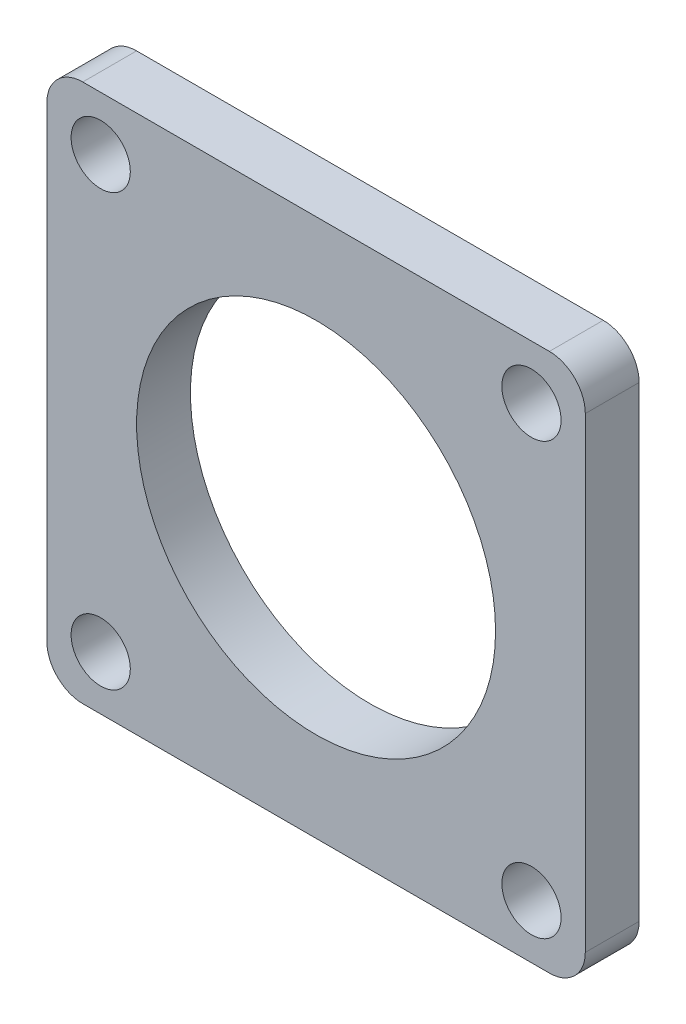
ISO-10303-21;
HEADER;
FILE_DESCRIPTION(('STEP AP214'),'2;1');
FILE_NAME('part.step','',(''),(''),'','','');
FILE_SCHEMA(('AUTOMOTIVE_DESIGN { 1 0 10303 214 1 1 1 1 }'));
ENDSEC;
DATA;
#1=APPLICATION_CONTEXT('core data for automotive mechanical design processes');
#2=APPLICATION_PROTOCOL_DEFINITION('international standard','automotive_design',2000,#1);
#3=PRODUCT_CONTEXT('',#1,'mechanical');
#4=PRODUCT('Part','Part','',(#3));
#5=PRODUCT_RELATED_PRODUCT_CATEGORY('part','',(#4));
#6=PRODUCT_DEFINITION_FORMATION('','',#4);
#7=PRODUCT_DEFINITION_CONTEXT('part definition',#1,'design');
#8=PRODUCT_DEFINITION('design','',#6,#7);
#9=PRODUCT_DEFINITION_SHAPE('','',#8);
#10=(LENGTH_UNIT() NAMED_UNIT(*) SI_UNIT(.MILLI.,.METRE.));
#11=(NAMED_UNIT(*) PLANE_ANGLE_UNIT() SI_UNIT($,.RADIAN.));
#12=(NAMED_UNIT(*) SI_UNIT($,.STERADIAN.) SOLID_ANGLE_UNIT());
#13=UNCERTAINTY_MEASURE_WITH_UNIT(LENGTH_MEASURE(1.E-05),#10,'distance_accuracy_value','');
#14=(GEOMETRIC_REPRESENTATION_CONTEXT(3) GLOBAL_UNCERTAINTY_ASSIGNED_CONTEXT((#13)) GLOBAL_UNIT_ASSIGNED_CONTEXT((#10,
#11,#12)) REPRESENTATION_CONTEXT('',''));
#15=CARTESIAN_POINT('',(0.,0.,0.));
#16=DIRECTION('',(0.,0.,1.));
#17=DIRECTION('',(1.,0.,0.));
#18=AXIS2_PLACEMENT_3D('',#15,#16,#17);
#19=CARTESIAN_POINT('',(0.,-15.,3.));
#20=DIRECTION('',(0.,-1.,0.));
#21=DIRECTION('',(1.,0.,0.));
#22=AXIS2_PLACEMENT_3D('',#19,#20,#21);
#23=PLANE('',#22);
#24=DIRECTION('',(-1.,0.,0.));
#25=VECTOR('',#24,1.);
#26=CARTESIAN_POINT('',(0.,-15.,3.));
#27=LINE('',#26,#25);
#28=CARTESIAN_POINT('',(13.,-15.,3.));
#29=VERTEX_POINT('',#28);
#30=CARTESIAN_POINT('',(-13.,-15.,3.));
#31=VERTEX_POINT('',#30);
#32=EDGE_CURVE('E162',#29,#31,#27,.T.);
#33=ORIENTED_EDGE('',*,*,#32,.T.);
#34=DIRECTION('',(0.,0.,-1.));
#35=VECTOR('',#34,1.);
#36=CARTESIAN_POINT('',(-13.,-15.,3.));
#37=LINE('',#36,#35);
#38=CARTESIAN_POINT('',(-13.,-15.,0.));
#39=VERTEX_POINT('',#38);
#40=EDGE_CURVE('E123',#31,#39,#37,.T.);
#41=ORIENTED_EDGE('',*,*,#40,.T.);
#42=DIRECTION('',(-1.,0.,0.));
#43=VECTOR('',#42,1.);
#44=CARTESIAN_POINT('',(0.,-15.,0.));
#45=LINE('',#44,#43);
#46=CARTESIAN_POINT('',(13.,-15.,0.));
#47=VERTEX_POINT('',#46);
#48=EDGE_CURVE('E107',#47,#39,#45,.T.);
#49=ORIENTED_EDGE('',*,*,#48,.F.);
#50=DIRECTION('',(0.,0.,-1.));
#51=VECTOR('',#50,1.);
#52=CARTESIAN_POINT('',(13.,-15.,3.));
#53=LINE('',#52,#51);
#54=EDGE_CURVE('E120',#47,#29,#53,.F.);
#55=ORIENTED_EDGE('',*,*,#54,.T.);
#56=EDGE_LOOP('',(#33,#41,#49,#55));
#57=FACE_BOUND('',#56,.T.);
#58=ADVANCED_FACE('F37',(#57),#23,.T.);
#59=CARTESIAN_POINT('',(15.,0.,3.));
#60=DIRECTION('',(-1.,0.,0.));
#61=DIRECTION('',(0.,-1.,0.));
#62=AXIS2_PLACEMENT_3D('',#59,#60,#61);
#63=PLANE('',#62);
#64=DIRECTION('',(0.,1.,0.));
#65=VECTOR('',#64,1.);
#66=CARTESIAN_POINT('',(15.,0.,3.));
#67=LINE('',#66,#65);
#68=CARTESIAN_POINT('',(15.,-13.,3.));
#69=VERTEX_POINT('',#68);
#70=CARTESIAN_POINT('',(15.,13.,3.));
#71=VERTEX_POINT('',#70);
#72=EDGE_CURVE('E160',#69,#71,#67,.T.);
#73=ORIENTED_EDGE('',*,*,#72,.F.);
#74=DIRECTION('',(0.,0.,-1.));
#75=VECTOR('',#74,1.);
#76=CARTESIAN_POINT('',(15.,-13.,0.));
#77=LINE('',#76,#75);
#78=CARTESIAN_POINT('',(15.,-13.,0.));
#79=VERTEX_POINT('',#78);
#80=EDGE_CURVE('E155',#69,#79,#77,.T.);
#81=ORIENTED_EDGE('',*,*,#80,.T.);
#82=DIRECTION('',(0.,1.,0.));
#83=VECTOR('',#82,1.);
#84=CARTESIAN_POINT('',(15.,0.,0.));
#85=LINE('',#84,#83);
#86=CARTESIAN_POINT('',(15.,13.,0.));
#87=VERTEX_POINT('',#86);
#88=EDGE_CURVE('E109',#79,#87,#85,.T.);
#89=ORIENTED_EDGE('',*,*,#88,.T.);
#90=DIRECTION('',(0.,0.,-1.));
#91=VECTOR('',#90,1.);
#92=CARTESIAN_POINT('',(15.,13.,3.));
#93=LINE('',#92,#91);
#94=EDGE_CURVE('E153',#87,#71,#93,.F.);
#95=ORIENTED_EDGE('',*,*,#94,.T.);
#96=EDGE_LOOP('',(#73,#81,#89,#95));
#97=FACE_BOUND('',#96,.T.);
#98=ADVANCED_FACE('F158',(#97),#63,.F.);
#99=CARTESIAN_POINT('',(0.,15.,3.));
#100=DIRECTION('',(0.,1.,0.));
#101=DIRECTION('',(0.,0.,1.));
#102=AXIS2_PLACEMENT_3D('',#99,#100,#101);
#103=PLANE('',#102);
#104=DIRECTION('',(1.,0.,0.));
#105=VECTOR('',#104,1.);
#106=CARTESIAN_POINT('',(0.,15.,3.));
#107=LINE('',#106,#105);
#108=CARTESIAN_POINT('',(-13.,15.,3.));
#109=VERTEX_POINT('',#108);
#110=CARTESIAN_POINT('',(13.,15.,3.));
#111=VERTEX_POINT('',#110);
#112=EDGE_CURVE('E161',#109,#111,#107,.T.);
#113=ORIENTED_EDGE('',*,*,#112,.T.);
#114=DIRECTION('',(0.,0.,-1.));
#115=VECTOR('',#114,1.);
#116=CARTESIAN_POINT('',(13.,15.,0.));
#117=LINE('',#116,#115);
#118=CARTESIAN_POINT('',(13.,15.,0.));
#119=VERTEX_POINT('',#118);
#120=EDGE_CURVE('E11',#111,#119,#117,.T.);
#121=ORIENTED_EDGE('',*,*,#120,.T.);
#122=DIRECTION('',(1.,0.,0.));
#123=VECTOR('',#122,1.);
#124=CARTESIAN_POINT('',(0.,15.,0.));
#125=LINE('',#124,#123);
#126=CARTESIAN_POINT('',(-13.,15.,0.));
#127=VERTEX_POINT('',#126);
#128=EDGE_CURVE('E182',#127,#119,#125,.T.);
#129=ORIENTED_EDGE('',*,*,#128,.F.);
#130=DIRECTION('',(0.,0.,-1.));
#131=VECTOR('',#130,1.);
#132=CARTESIAN_POINT('',(-13.,15.,3.));
#133=LINE('',#132,#131);
#134=EDGE_CURVE('E45',#127,#109,#133,.F.);
#135=ORIENTED_EDGE('',*,*,#134,.T.);
#136=EDGE_LOOP('',(#113,#121,#129,#135));
#137=FACE_BOUND('',#136,.T.);
#138=ADVANCED_FACE('F225',(#137),#103,.T.);
#139=CARTESIAN_POINT('',(12.,12.,3.));
#140=DIRECTION('',(0.,0.,-1.));
#141=DIRECTION('',(-1.,0.,0.));
#142=AXIS2_PLACEMENT_3D('',#139,#140,#141);
#143=CYLINDRICAL_SURFACE('',#142,1.65);
#144=CARTESIAN_POINT('',(12.,12.,3.));
#145=DIRECTION('',(0.,0.,1.));
#146=DIRECTION('',(1.,0.,0.));
#147=AXIS2_PLACEMENT_3D('',#144,#145,#146);
#148=CIRCLE('',#147,1.65);
#149=CARTESIAN_POINT('',(13.65,12.,3.));
#150=VERTEX_POINT('',#149);
#151=EDGE_CURVE('E133',#150,#150,#148,.T.);
#152=ORIENTED_EDGE('',*,*,#151,.T.);
#153=EDGE_LOOP('',(#152));
#154=FACE_BOUND('',#153,.T.);
#155=CARTESIAN_POINT('',(12.,12.,0.));
#156=DIRECTION('',(0.,0.,1.));
#157=DIRECTION('',(1.,0.,0.));
#158=AXIS2_PLACEMENT_3D('',#155,#156,#157);
#159=CIRCLE('',#158,1.65);
#160=CARTESIAN_POINT('',(13.65,12.,0.));
#161=VERTEX_POINT('',#160);
#162=EDGE_CURVE('E196',#161,#161,#159,.T.);
#163=ORIENTED_EDGE('',*,*,#162,.F.);
#164=EDGE_LOOP('',(#163));
#165=FACE_BOUND('',#164,.T.);
#166=ADVANCED_FACE('F259',(#154,#165),#143,.F.);
#167=CARTESIAN_POINT('',(-12.,-12.,3.));
#168=DIRECTION('',(0.,0.,-1.));
#169=DIRECTION('',(-1.,0.,0.));
#170=AXIS2_PLACEMENT_3D('',#167,#168,#169);
#171=CYLINDRICAL_SURFACE('',#170,1.65);
#172=CARTESIAN_POINT('',(-12.,-12.,3.));
#173=DIRECTION('',(0.,0.,1.));
#174=DIRECTION('',(1.,0.,0.));
#175=AXIS2_PLACEMENT_3D('',#172,#173,#174);
#176=CIRCLE('',#175,1.65);
#177=CARTESIAN_POINT('',(-10.35,-12.,3.));
#178=VERTEX_POINT('',#177);
#179=EDGE_CURVE('E176',#178,#178,#176,.T.);
#180=ORIENTED_EDGE('',*,*,#179,.T.);
#181=EDGE_LOOP('',(#180));
#182=FACE_BOUND('',#181,.T.);
#183=CARTESIAN_POINT('',(-12.,-12.,0.));
#184=DIRECTION('',(0.,0.,1.));
#185=DIRECTION('',(1.,0.,0.));
#186=AXIS2_PLACEMENT_3D('',#183,#184,#185);
#187=CIRCLE('',#186,1.65);
#188=CARTESIAN_POINT('',(-10.35,-12.,0.));
#189=VERTEX_POINT('',#188);
#190=EDGE_CURVE('E194',#189,#189,#187,.T.);
#191=ORIENTED_EDGE('',*,*,#190,.F.);
#192=EDGE_LOOP('',(#191));
#193=FACE_BOUND('',#192,.T.);
#194=ADVANCED_FACE('F262',(#182,#193),#171,.F.);
#195=CARTESIAN_POINT('',(0.,0.,3.));
#196=DIRECTION('',(0.,0.,-1.));
#197=DIRECTION('',(-1.,0.,0.));
#198=AXIS2_PLACEMENT_3D('',#195,#196,#197);
#199=CYLINDRICAL_SURFACE('',#198,10.);
#200=CARTESIAN_POINT('',(0.,0.,3.));
#201=DIRECTION('',(0.,0.,1.));
#202=DIRECTION('',(1.,0.,0.));
#203=AXIS2_PLACEMENT_3D('',#200,#201,#202);
#204=CIRCLE('',#203,10.);
#205=CARTESIAN_POINT('',(10.,0.,3.));
#206=VERTEX_POINT('',#205);
#207=EDGE_CURVE('E173',#206,#206,#204,.T.);
#208=ORIENTED_EDGE('',*,*,#207,.T.);
#209=EDGE_LOOP('',(#208));
#210=FACE_BOUND('',#209,.T.);
#211=CARTESIAN_POINT('',(0.,0.,0.));
#212=DIRECTION('',(0.,0.,1.));
#213=DIRECTION('',(1.,0.,0.));
#214=AXIS2_PLACEMENT_3D('',#211,#212,#213);
#215=CIRCLE('',#214,10.);
#216=CARTESIAN_POINT('',(10.,0.,0.));
#217=VERTEX_POINT('',#216);
#218=EDGE_CURVE('E191',#217,#217,#215,.T.);
#219=ORIENTED_EDGE('',*,*,#218,.F.);
#220=EDGE_LOOP('',(#219));
#221=FACE_BOUND('',#220,.T.);
#222=ADVANCED_FACE('F267',(#210,#221),#199,.F.);
#223=CARTESIAN_POINT('',(-12.,12.,3.));
#224=DIRECTION('',(0.,0.,-1.));
#225=DIRECTION('',(-1.,0.,0.));
#226=AXIS2_PLACEMENT_3D('',#223,#224,#225);
#227=CYLINDRICAL_SURFACE('',#226,1.65);
#228=CARTESIAN_POINT('',(-12.,12.,3.));
#229=DIRECTION('',(0.,0.,1.));
#230=DIRECTION('',(1.,0.,0.));
#231=AXIS2_PLACEMENT_3D('',#228,#229,#230);
#232=CIRCLE('',#231,1.65);
#233=CARTESIAN_POINT('',(-10.35,12.,3.));
#234=VERTEX_POINT('',#233);
#235=EDGE_CURVE('E170',#234,#234,#232,.T.);
#236=ORIENTED_EDGE('',*,*,#235,.T.);
#237=EDGE_LOOP('',(#236));
#238=FACE_BOUND('',#237,.T.);
#239=CARTESIAN_POINT('',(-12.,12.,0.));
#240=DIRECTION('',(0.,0.,1.));
#241=DIRECTION('',(1.,0.,0.));
#242=AXIS2_PLACEMENT_3D('',#239,#240,#241);
#243=CIRCLE('',#242,1.65);
#244=CARTESIAN_POINT('',(-10.35,12.,0.));
#245=VERTEX_POINT('',#244);
#246=EDGE_CURVE('E188',#245,#245,#243,.T.);
#247=ORIENTED_EDGE('',*,*,#246,.F.);
#248=EDGE_LOOP('',(#247));
#249=FACE_BOUND('',#248,.T.);
#250=ADVANCED_FACE('F215',(#238,#249),#227,.F.);
#251=CARTESIAN_POINT('',(-15.,0.,3.));
#252=DIRECTION('',(-1.,0.,0.));
#253=DIRECTION('',(0.,0.,1.));
#254=AXIS2_PLACEMENT_3D('',#251,#252,#253);
#255=PLANE('',#254);
#256=DIRECTION('',(0.,1.,0.));
#257=VECTOR('',#256,1.);
#258=CARTESIAN_POINT('',(-15.,0.,0.));
#259=LINE('',#258,#257);
#260=CARTESIAN_POINT('',(-15.,-13.,0.));
#261=VERTEX_POINT('',#260);
#262=CARTESIAN_POINT('',(-15.,13.,0.));
#263=VERTEX_POINT('',#262);
#264=EDGE_CURVE('E185',#261,#263,#259,.T.);
#265=ORIENTED_EDGE('',*,*,#264,.F.);
#266=DIRECTION('',(0.,0.,-1.));
#267=VECTOR('',#266,1.);
#268=CARTESIAN_POINT('',(-15.,-13.,3.));
#269=LINE('',#268,#267);
#270=CARTESIAN_POINT('',(-15.,-13.,3.));
#271=VERTEX_POINT('',#270);
#272=EDGE_CURVE('E145',#261,#271,#269,.F.);
#273=ORIENTED_EDGE('',*,*,#272,.T.);
#274=DIRECTION('',(0.,1.,0.));
#275=VECTOR('',#274,1.);
#276=CARTESIAN_POINT('',(-15.,0.,3.));
#277=LINE('',#276,#275);
#278=CARTESIAN_POINT('',(-15.,13.,3.));
#279=VERTEX_POINT('',#278);
#280=EDGE_CURVE('E164',#271,#279,#277,.T.);
#281=ORIENTED_EDGE('',*,*,#280,.T.);
#282=DIRECTION('',(0.,0.,-1.));
#283=VECTOR('',#282,1.);
#284=CARTESIAN_POINT('',(-15.,13.,3.));
#285=LINE('',#284,#283);
#286=EDGE_CURVE('E142',#279,#263,#285,.T.);
#287=ORIENTED_EDGE('',*,*,#286,.T.);
#288=EDGE_LOOP('',(#265,#273,#281,#287));
#289=FACE_BOUND('',#288,.T.);
#290=ADVANCED_FACE('F207',(#289),#255,.T.);
#291=CARTESIAN_POINT('',(12.,-12.,3.));
#292=DIRECTION('',(0.,0.,-1.));
#293=DIRECTION('',(-1.,0.,0.));
#294=AXIS2_PLACEMENT_3D('',#291,#292,#293);
#295=CYLINDRICAL_SURFACE('',#294,1.65);
#296=CARTESIAN_POINT('',(12.,-12.,3.));
#297=DIRECTION('',(0.,0.,1.));
#298=DIRECTION('',(1.,0.,0.));
#299=AXIS2_PLACEMENT_3D('',#296,#297,#298);
#300=CIRCLE('',#299,1.65);
#301=CARTESIAN_POINT('',(13.65,-12.,3.));
#302=VERTEX_POINT('',#301);
#303=EDGE_CURVE('E128',#302,#302,#300,.T.);
#304=ORIENTED_EDGE('',*,*,#303,.T.);
#305=EDGE_LOOP('',(#304));
#306=FACE_BOUND('',#305,.T.);
#307=CARTESIAN_POINT('',(12.,-12.,0.));
#308=DIRECTION('',(0.,0.,1.));
#309=DIRECTION('',(1.,0.,0.));
#310=AXIS2_PLACEMENT_3D('',#307,#308,#309);
#311=CIRCLE('',#310,1.65);
#312=CARTESIAN_POINT('',(13.65,-12.,0.));
#313=VERTEX_POINT('',#312);
#314=EDGE_CURVE('E136',#313,#313,#311,.T.);
#315=ORIENTED_EDGE('',*,*,#314,.F.);
#316=EDGE_LOOP('',(#315));
#317=FACE_BOUND('',#316,.T.);
#318=ADVANCED_FACE('F204',(#306,#317),#295,.F.);
#319=CARTESIAN_POINT('',(0.,0.,3.));
#320=DIRECTION('',(0.,0.,1.));
#321=DIRECTION('',(1.,0.,0.));
#322=AXIS2_PLACEMENT_3D('',#319,#320,#321);
#323=PLANE('',#322);
#324=ORIENTED_EDGE('',*,*,#280,.F.);
#325=CARTESIAN_POINT('',(-13.,-13.,3.));
#326=DIRECTION('',(0.,0.,1.));
#327=DIRECTION('',(1.,0.,0.));
#328=AXIS2_PLACEMENT_3D('',#325,#326,#327);
#329=CIRCLE('',#328,2.);
#330=EDGE_CURVE('E151',#271,#31,#329,.T.);
#331=ORIENTED_EDGE('',*,*,#330,.T.);
#332=ORIENTED_EDGE('',*,*,#32,.F.);
#333=CARTESIAN_POINT('',(13.,-13.,3.));
#334=DIRECTION('',(0.,0.,1.));
#335=DIRECTION('',(1.,0.,0.));
#336=AXIS2_PLACEMENT_3D('',#333,#334,#335);
#337=CIRCLE('',#336,2.);
#338=EDGE_CURVE('E127',#29,#69,#337,.T.);
#339=ORIENTED_EDGE('',*,*,#338,.T.);
#340=ORIENTED_EDGE('',*,*,#72,.T.);
#341=CARTESIAN_POINT('',(13.,13.,3.));
#342=DIRECTION('',(0.,0.,1.));
#343=DIRECTION('',(1.,0.,0.));
#344=AXIS2_PLACEMENT_3D('',#341,#342,#343);
#345=CIRCLE('',#344,2.);
#346=EDGE_CURVE('E52',#71,#111,#345,.T.);
#347=ORIENTED_EDGE('',*,*,#346,.T.);
#348=ORIENTED_EDGE('',*,*,#112,.F.);
#349=CARTESIAN_POINT('',(-13.,13.,3.));
#350=DIRECTION('',(0.,0.,1.));
#351=DIRECTION('',(1.,0.,0.));
#352=AXIS2_PLACEMENT_3D('',#349,#350,#351);
#353=CIRCLE('',#352,2.);
#354=EDGE_CURVE('E147',#109,#279,#353,.T.);
#355=ORIENTED_EDGE('',*,*,#354,.T.);
#356=EDGE_LOOP('',(#324,#331,#332,#339,#340,#347,#348,#355));
#357=FACE_BOUND('',#356,.T.);
#358=ORIENTED_EDGE('',*,*,#235,.F.);
#359=EDGE_LOOP('',(#358));
#360=FACE_BOUND('',#359,.T.);
#361=ORIENTED_EDGE('',*,*,#207,.F.);
#362=EDGE_LOOP('',(#361));
#363=FACE_BOUND('',#362,.T.);
#364=ORIENTED_EDGE('',*,*,#179,.F.);
#365=EDGE_LOOP('',(#364));
#366=FACE_BOUND('',#365,.T.);
#367=ORIENTED_EDGE('',*,*,#151,.F.);
#368=EDGE_LOOP('',(#367));
#369=FACE_BOUND('',#368,.T.);
#370=ORIENTED_EDGE('',*,*,#303,.F.);
#371=EDGE_LOOP('',(#370));
#372=FACE_BOUND('',#371,.T.);
#373=ADVANCED_FACE('F206',(#357,#360,#363,#366,#369,#372),#323,.T.);
#374=CARTESIAN_POINT('',(0.,0.,0.));
#375=DIRECTION('',(0.,0.,1.));
#376=DIRECTION('',(1.,0.,0.));
#377=AXIS2_PLACEMENT_3D('',#374,#375,#376);
#378=PLANE('',#377);
#379=ORIENTED_EDGE('',*,*,#48,.T.);
#380=CARTESIAN_POINT('',(-13.,-13.,0.));
#381=DIRECTION('',(0.,0.,1.));
#382=DIRECTION('',(1.,0.,0.));
#383=AXIS2_PLACEMENT_3D('',#380,#381,#382);
#384=CIRCLE('',#383,2.);
#385=EDGE_CURVE('E114',#39,#261,#384,.F.);
#386=ORIENTED_EDGE('',*,*,#385,.T.);
#387=ORIENTED_EDGE('',*,*,#264,.T.);
#388=CARTESIAN_POINT('',(-13.,13.,0.));
#389=DIRECTION('',(0.,0.,1.));
#390=DIRECTION('',(1.,0.,0.));
#391=AXIS2_PLACEMENT_3D('',#388,#389,#390);
#392=CIRCLE('',#391,2.);
#393=EDGE_CURVE('E130',#263,#127,#392,.F.);
#394=ORIENTED_EDGE('',*,*,#393,.T.);
#395=ORIENTED_EDGE('',*,*,#128,.T.);
#396=CARTESIAN_POINT('',(13.,13.,0.));
#397=DIRECTION('',(0.,0.,1.));
#398=DIRECTION('',(1.,0.,0.));
#399=AXIS2_PLACEMENT_3D('',#396,#397,#398);
#400=CIRCLE('',#399,2.);
#401=EDGE_CURVE('E115',#119,#87,#400,.F.);
#402=ORIENTED_EDGE('',*,*,#401,.T.);
#403=ORIENTED_EDGE('',*,*,#88,.F.);
#404=CARTESIAN_POINT('',(13.,-13.,0.));
#405=DIRECTION('',(0.,0.,1.));
#406=DIRECTION('',(1.,0.,0.));
#407=AXIS2_PLACEMENT_3D('',#404,#405,#406);
#408=CIRCLE('',#407,2.);
#409=EDGE_CURVE('E103',#79,#47,#408,.F.);
#410=ORIENTED_EDGE('',*,*,#409,.T.);
#411=EDGE_LOOP('',(#379,#386,#387,#394,#395,#402,#403,#410));
#412=FACE_BOUND('',#411,.T.);
#413=ORIENTED_EDGE('',*,*,#246,.T.);
#414=EDGE_LOOP('',(#413));
#415=FACE_BOUND('',#414,.T.);
#416=ORIENTED_EDGE('',*,*,#218,.T.);
#417=EDGE_LOOP('',(#416));
#418=FACE_BOUND('',#417,.T.);
#419=ORIENTED_EDGE('',*,*,#190,.T.);
#420=EDGE_LOOP('',(#419));
#421=FACE_BOUND('',#420,.T.);
#422=ORIENTED_EDGE('',*,*,#162,.T.);
#423=EDGE_LOOP('',(#422));
#424=FACE_BOUND('',#423,.T.);
#425=ORIENTED_EDGE('',*,*,#314,.T.);
#426=EDGE_LOOP('',(#425));
#427=FACE_BOUND('',#426,.T.);
#428=ADVANCED_FACE('F105',(#412,#415,#418,#421,#424,#427),#378,.F.);
#429=CARTESIAN_POINT('',(-13.,-13.,3.));
#430=DIRECTION('',(0.,0.,-1.));
#431=DIRECTION('',(-1.,0.,0.));
#432=AXIS2_PLACEMENT_3D('',#429,#430,#431);
#433=CYLINDRICAL_SURFACE('',#432,2.);
#434=ORIENTED_EDGE('',*,*,#330,.F.);
#435=ORIENTED_EDGE('',*,*,#272,.F.);
#436=ORIENTED_EDGE('',*,*,#385,.F.);
#437=ORIENTED_EDGE('',*,*,#40,.F.);
#438=EDGE_LOOP('',(#434,#435,#436,#437));
#439=FACE_BOUND('',#438,.T.);
#440=ADVANCED_FACE('F229',(#439),#433,.T.);
#441=CARTESIAN_POINT('',(13.,-13.,3.));
#442=DIRECTION('',(0.,0.,1.));
#443=DIRECTION('',(1.,0.,0.));
#444=AXIS2_PLACEMENT_3D('',#441,#442,#443);
#445=CYLINDRICAL_SURFACE('',#444,2.);
#446=ORIENTED_EDGE('',*,*,#338,.F.);
#447=ORIENTED_EDGE('',*,*,#54,.F.);
#448=ORIENTED_EDGE('',*,*,#409,.F.);
#449=ORIENTED_EDGE('',*,*,#80,.F.);
#450=EDGE_LOOP('',(#446,#447,#448,#449));
#451=FACE_BOUND('',#450,.T.);
#452=ADVANCED_FACE('F126',(#451),#445,.T.);
#453=CARTESIAN_POINT('',(13.,13.,3.));
#454=DIRECTION('',(0.,0.,1.));
#455=DIRECTION('',(1.,0.,0.));
#456=AXIS2_PLACEMENT_3D('',#453,#454,#455);
#457=CYLINDRICAL_SURFACE('',#456,2.);
#458=ORIENTED_EDGE('',*,*,#346,.F.);
#459=ORIENTED_EDGE('',*,*,#94,.F.);
#460=ORIENTED_EDGE('',*,*,#401,.F.);
#461=ORIENTED_EDGE('',*,*,#120,.F.);
#462=EDGE_LOOP('',(#458,#459,#460,#461));
#463=FACE_BOUND('',#462,.T.);
#464=ADVANCED_FACE('F234',(#463),#457,.T.);
#465=CARTESIAN_POINT('',(-13.,13.,3.));
#466=DIRECTION('',(0.,0.,-1.));
#467=DIRECTION('',(-1.,0.,0.));
#468=AXIS2_PLACEMENT_3D('',#465,#466,#467);
#469=CYLINDRICAL_SURFACE('',#468,2.);
#470=ORIENTED_EDGE('',*,*,#354,.F.);
#471=ORIENTED_EDGE('',*,*,#134,.F.);
#472=ORIENTED_EDGE('',*,*,#393,.F.);
#473=ORIENTED_EDGE('',*,*,#286,.F.);
#474=EDGE_LOOP('',(#470,#471,#472,#473));
#475=FACE_BOUND('',#474,.T.);
#476=ADVANCED_FACE('F39',(#475),#469,.T.);
#477=CLOSED_SHELL('',(#58,#98,#138,#166,#194,#222,#250,#290,#318,#373,#428,#440,#452,#464,#476));
#478=MANIFOLD_SOLID_BREP('B2',#477);
#479=ADVANCED_BREP_SHAPE_REPRESENTATION('',(#18,#478),#14);
#480=SHAPE_DEFINITION_REPRESENTATION(#9,#479);
ENDSEC;
END-ISO-10303-21;
